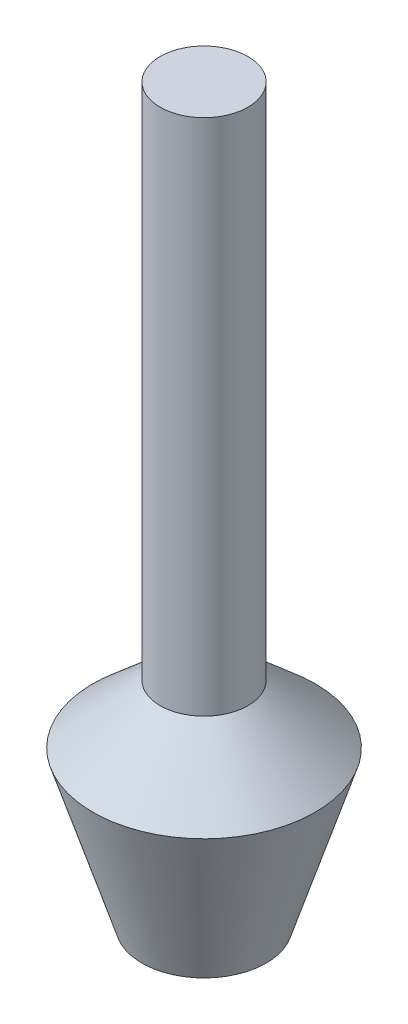
ISO-10303-21;
HEADER;
FILE_DESCRIPTION(('STEP AP214'),'2;1');
FILE_NAME('part.step','',(''),(''),'','','');
FILE_SCHEMA(('AUTOMOTIVE_DESIGN { 1 0 10303 214 1 1 1 1 }'));
ENDSEC;
DATA;
#1=APPLICATION_CONTEXT('core data for automotive mechanical design processes');
#2=APPLICATION_PROTOCOL_DEFINITION('international standard','automotive_design',2000,#1);
#3=PRODUCT_CONTEXT('',#1,'mechanical');
#4=PRODUCT('Part','Part','',(#3));
#5=PRODUCT_RELATED_PRODUCT_CATEGORY('part','',(#4));
#6=PRODUCT_DEFINITION_FORMATION('','',#4);
#7=PRODUCT_DEFINITION_CONTEXT('part definition',#1,'design');
#8=PRODUCT_DEFINITION('design','',#6,#7);
#9=PRODUCT_DEFINITION_SHAPE('','',#8);
#10=(LENGTH_UNIT() NAMED_UNIT(*) SI_UNIT(.MILLI.,.METRE.));
#11=(NAMED_UNIT(*) PLANE_ANGLE_UNIT() SI_UNIT($,.RADIAN.));
#12=(NAMED_UNIT(*) SI_UNIT($,.STERADIAN.) SOLID_ANGLE_UNIT());
#13=UNCERTAINTY_MEASURE_WITH_UNIT(LENGTH_MEASURE(1.E-05),#10,'distance_accuracy_value','');
#14=(GEOMETRIC_REPRESENTATION_CONTEXT(3) GLOBAL_UNCERTAINTY_ASSIGNED_CONTEXT((#13)) GLOBAL_UNIT_ASSIGNED_CONTEXT((#10,
#11,#12)) REPRESENTATION_CONTEXT('',''));
#15=CARTESIAN_POINT('',(0.,0.,0.));
#16=DIRECTION('',(0.,0.,1.));
#17=DIRECTION('',(1.,0.,0.));
#18=AXIS2_PLACEMENT_3D('',#15,#16,#17);
#19=CARTESIAN_POINT('',(0.,13.462,0.));
#20=DIRECTION('',(0.,-1.,0.));
#21=DIRECTION('',(0.,0.,-1.));
#22=AXIS2_PLACEMENT_3D('',#19,#20,#21);
#23=CONICAL_SURFACE('',#22,9.652,0.855052737125842);
#24=CARTESIAN_POINT('',(0.,18.5420000000018,0.));
#25=DIRECTION('',(0.,-1.,0.));
#26=DIRECTION('',(0.,0.,-1.));
#27=AXIS2_PLACEMENT_3D('',#24,#25,#26);
#28=CIRCLE('',#27,3.81000000000001);
#29=CARTESIAN_POINT('',(0.,18.5420000000018,-3.81000000000001));
#30=VERTEX_POINT('',#29);
#31=EDGE_CURVE('E10',#30,#30,#28,.T.);
#32=ORIENTED_EDGE('',*,*,#31,.T.);
#33=EDGE_LOOP('',(#32));
#34=FACE_BOUND('',#33,.T.);
#35=CARTESIAN_POINT('',(0.,13.462,0.));
#36=DIRECTION('',(0.,-1.,0.));
#37=DIRECTION('',(0.,0.,-1.));
#38=AXIS2_PLACEMENT_3D('',#35,#36,#37);
#39=CIRCLE('',#38,9.652);
#40=CARTESIAN_POINT('',(0.,13.462,-9.652));
#41=VERTEX_POINT('',#40);
#42=EDGE_CURVE('E48',#41,#41,#39,.T.);
#43=ORIENTED_EDGE('',*,*,#42,.F.);
#44=EDGE_LOOP('',(#43));
#45=FACE_BOUND('',#44,.T.);
#46=ADVANCED_FACE('F34',(#34,#45),#23,.T.);
#47=CARTESIAN_POINT('',(0.,0.,0.));
#48=DIRECTION('',(0.,-1.,0.));
#49=DIRECTION('',(0.,0.,-1.));
#50=AXIS2_PLACEMENT_3D('',#47,#48,#49);
#51=CYLINDRICAL_SURFACE('',#50,3.81000000000001);
#52=ORIENTED_EDGE('',*,*,#31,.F.);
#53=EDGE_LOOP('',(#52));
#54=FACE_BOUND('',#53,.T.);
#55=CARTESIAN_POINT('',(0.,63.5,0.));
#56=DIRECTION('',(0.,-1.,0.));
#57=DIRECTION('',(0.,0.,-1.));
#58=AXIS2_PLACEMENT_3D('',#55,#56,#57);
#59=CIRCLE('',#58,3.81000000000001);
#60=CARTESIAN_POINT('',(0.,63.5,-3.81000000000001));
#61=VERTEX_POINT('',#60);
#62=EDGE_CURVE('E40',#61,#61,#59,.T.);
#63=ORIENTED_EDGE('',*,*,#62,.T.);
#64=EDGE_LOOP('',(#63));
#65=FACE_BOUND('',#64,.T.);
#66=ADVANCED_FACE('F57',(#54,#65),#51,.T.);
#67=CARTESIAN_POINT('',(0.,63.5,0.));
#68=DIRECTION('',(0.,-1.,0.));
#69=DIRECTION('',(0.,0.,-1.));
#70=AXIS2_PLACEMENT_3D('',#67,#68,#69);
#71=PLANE('',#70);
#72=ORIENTED_EDGE('',*,*,#62,.F.);
#73=EDGE_LOOP('',(#72));
#74=FACE_BOUND('',#73,.T.);
#75=ADVANCED_FACE('F61',(#74),#71,.F.);
#76=CARTESIAN_POINT('',(0.,0.,0.));
#77=DIRECTION('',(0.,-1.,0.));
#78=DIRECTION('',(0.,0.,-1.));
#79=AXIS2_PLACEMENT_3D('',#76,#77,#78);
#80=PLANE('',#79);
#81=CARTESIAN_POINT('',(0.,0.,0.));
#82=DIRECTION('',(0.,-1.,0.));
#83=DIRECTION('',(0.,0.,-1.));
#84=AXIS2_PLACEMENT_3D('',#81,#82,#83);
#85=CIRCLE('',#84,5.3975);
#86=CARTESIAN_POINT('',(0.,0.,-5.3975));
#87=VERTEX_POINT('',#86);
#88=EDGE_CURVE('E44',#87,#87,#85,.T.);
#89=ORIENTED_EDGE('',*,*,#88,.T.);
#90=EDGE_LOOP('',(#89));
#91=FACE_BOUND('',#90,.T.);
#92=ADVANCED_FACE('F66',(#91),#80,.T.);
#93=CARTESIAN_POINT('',(0.,13.462,0.));
#94=DIRECTION('',(0.,1.,0.));
#95=DIRECTION('',(0.,0.,1.));
#96=AXIS2_PLACEMENT_3D('',#93,#94,#95);
#97=CONICAL_SURFACE('',#96,9.652,0.306104605035329);
#98=ORIENTED_EDGE('',*,*,#88,.F.);
#99=EDGE_LOOP('',(#98));
#100=FACE_BOUND('',#99,.T.);
#101=ORIENTED_EDGE('',*,*,#42,.T.);
#102=EDGE_LOOP('',(#101));
#103=FACE_BOUND('',#102,.T.);
#104=ADVANCED_FACE('F54',(#100,#103),#97,.T.);
#105=CLOSED_SHELL('',(#46,#66,#75,#92,#104));
#106=MANIFOLD_SOLID_BREP('B2',#105);
#107=ADVANCED_BREP_SHAPE_REPRESENTATION('',(#18,#106),#14);
#108=SHAPE_DEFINITION_REPRESENTATION(#9,#107);
ENDSEC;
END-ISO-10303-21;
